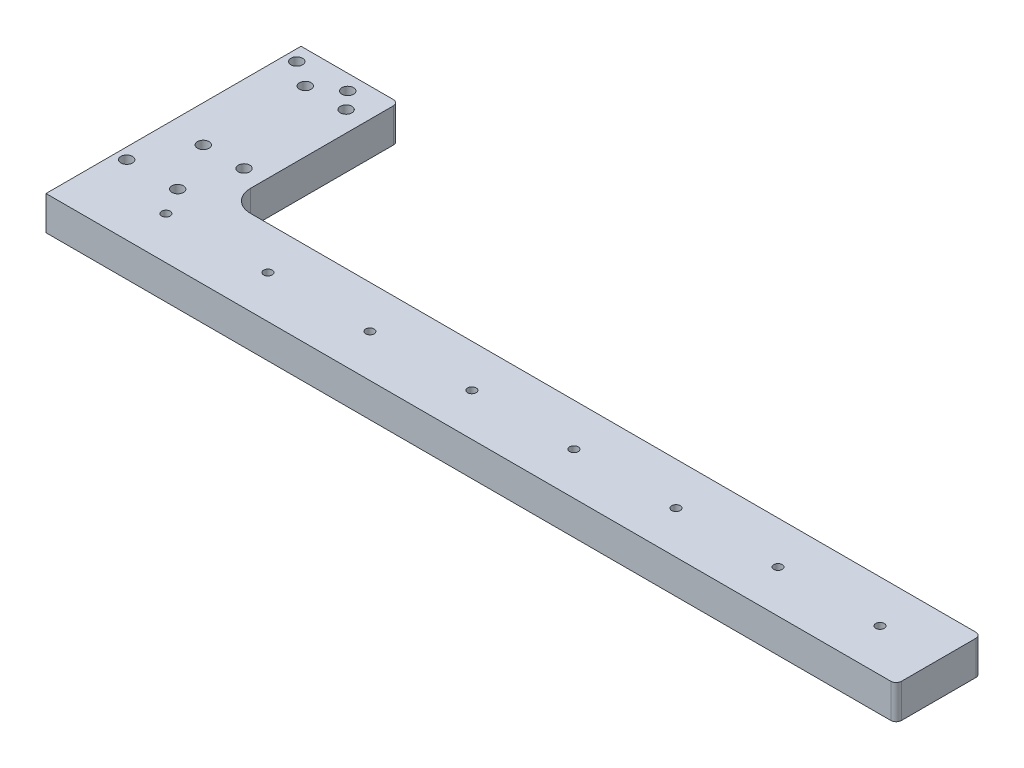
ISO-10303-21;
HEADER;
FILE_DESCRIPTION(('STEP AP214'),'2;1');
FILE_NAME('part.step','',(''),(''),'','','');
FILE_SCHEMA(('AUTOMOTIVE_DESIGN { 1 0 10303 214 1 1 1 1 }'));
ENDSEC;
DATA;
#1=APPLICATION_CONTEXT('core data for automotive mechanical design processes');
#2=APPLICATION_PROTOCOL_DEFINITION('international standard','automotive_design',2000,#1);
#3=PRODUCT_CONTEXT('',#1,'mechanical');
#4=PRODUCT('Part','Part','',(#3));
#5=PRODUCT_RELATED_PRODUCT_CATEGORY('part','',(#4));
#6=PRODUCT_DEFINITION_FORMATION('','',#4);
#7=PRODUCT_DEFINITION_CONTEXT('part definition',#1,'design');
#8=PRODUCT_DEFINITION('design','',#6,#7);
#9=PRODUCT_DEFINITION_SHAPE('','',#8);
#10=(LENGTH_UNIT() NAMED_UNIT(*) SI_UNIT(.MILLI.,.METRE.));
#11=(NAMED_UNIT(*) PLANE_ANGLE_UNIT() SI_UNIT($,.RADIAN.));
#12=(NAMED_UNIT(*) SI_UNIT($,.STERADIAN.) SOLID_ANGLE_UNIT());
#13=UNCERTAINTY_MEASURE_WITH_UNIT(LENGTH_MEASURE(1.E-05),#10,'distance_accuracy_value','');
#14=(GEOMETRIC_REPRESENTATION_CONTEXT(3) GLOBAL_UNCERTAINTY_ASSIGNED_CONTEXT((#13)) GLOBAL_UNIT_ASSIGNED_CONTEXT((#10,
#11,#12)) REPRESENTATION_CONTEXT('',''));
#15=CARTESIAN_POINT('',(0.,0.,0.));
#16=DIRECTION('',(0.,0.,1.));
#17=DIRECTION('',(1.,0.,0.));
#18=AXIS2_PLACEMENT_3D('',#15,#16,#17);
#19=CARTESIAN_POINT('',(465.5,10.,-25.));
#20=DIRECTION('',(0.,1.,0.));
#21=DIRECTION('',(0.,0.,1.));
#22=AXIS2_PLACEMENT_3D('',#19,#20,#21);
#23=CYLINDRICAL_SURFACE('',#22,2.49999999999999);
#24=CARTESIAN_POINT('',(465.5,10.,-25.));
#25=DIRECTION('',(0.,1.,0.));
#26=DIRECTION('',(0.,0.,1.));
#27=AXIS2_PLACEMENT_3D('',#24,#25,#26);
#28=CIRCLE('',#27,2.49999999999999);
#29=CARTESIAN_POINT('',(465.5,10.,-22.5));
#30=VERTEX_POINT('',#29);
#31=EDGE_CURVE('E48',#30,#30,#28,.T.);
#32=ORIENTED_EDGE('',*,*,#31,.T.);
#33=EDGE_LOOP('',(#32));
#34=FACE_BOUND('',#33,.T.);
#35=CARTESIAN_POINT('',(465.5,-10.,-25.));
#36=DIRECTION('',(0.,1.,0.));
#37=DIRECTION('',(0.,0.,1.));
#38=AXIS2_PLACEMENT_3D('',#35,#36,#37);
#39=CIRCLE('',#38,2.49999999999999);
#40=CARTESIAN_POINT('',(465.5,-10.,-22.5));
#41=VERTEX_POINT('',#40);
#42=EDGE_CURVE('E11',#41,#41,#39,.T.);
#43=ORIENTED_EDGE('',*,*,#42,.F.);
#44=EDGE_LOOP('',(#43));
#45=FACE_BOUND('',#44,.T.);
#46=ADVANCED_FACE('F40',(#34,#45),#23,.F.);
#47=CARTESIAN_POINT('',(405.5,10.,-25.));
#48=DIRECTION('',(0.,1.,0.));
#49=DIRECTION('',(0.,0.,1.));
#50=AXIS2_PLACEMENT_3D('',#47,#48,#49);
#51=CYLINDRICAL_SURFACE('',#50,2.49999999999999);
#52=CARTESIAN_POINT('',(405.5,10.,-25.));
#53=DIRECTION('',(0.,1.,0.));
#54=DIRECTION('',(0.,0.,1.));
#55=AXIS2_PLACEMENT_3D('',#52,#53,#54);
#56=CIRCLE('',#55,2.49999999999999);
#57=CARTESIAN_POINT('',(405.5,10.,-22.5));
#58=VERTEX_POINT('',#57);
#59=EDGE_CURVE('E214',#58,#58,#56,.T.);
#60=ORIENTED_EDGE('',*,*,#59,.T.);
#61=EDGE_LOOP('',(#60));
#62=FACE_BOUND('',#61,.T.);
#63=CARTESIAN_POINT('',(405.5,-10.,-25.));
#64=DIRECTION('',(0.,1.,0.));
#65=DIRECTION('',(0.,0.,1.));
#66=AXIS2_PLACEMENT_3D('',#63,#64,#65);
#67=CIRCLE('',#66,2.49999999999999);
#68=CARTESIAN_POINT('',(405.5,-10.,-22.5));
#69=VERTEX_POINT('',#68);
#70=EDGE_CURVE('E217',#69,#69,#67,.T.);
#71=ORIENTED_EDGE('',*,*,#70,.F.);
#72=EDGE_LOOP('',(#71));
#73=FACE_BOUND('',#72,.T.);
#74=ADVANCED_FACE('F241',(#62,#73),#51,.F.);
#75=CARTESIAN_POINT('',(345.5,10.,-25.));
#76=DIRECTION('',(0.,1.,0.));
#77=DIRECTION('',(0.,0.,1.));
#78=AXIS2_PLACEMENT_3D('',#75,#76,#77);
#79=CYLINDRICAL_SURFACE('',#78,2.49999999999999);
#80=CARTESIAN_POINT('',(345.5,10.,-25.));
#81=DIRECTION('',(0.,1.,0.));
#82=DIRECTION('',(0.,0.,1.));
#83=AXIS2_PLACEMENT_3D('',#80,#81,#82);
#84=CIRCLE('',#83,2.49999999999999);
#85=CARTESIAN_POINT('',(345.5,10.,-22.5));
#86=VERTEX_POINT('',#85);
#87=EDGE_CURVE('E208',#86,#86,#84,.T.);
#88=ORIENTED_EDGE('',*,*,#87,.T.);
#89=EDGE_LOOP('',(#88));
#90=FACE_BOUND('',#89,.T.);
#91=CARTESIAN_POINT('',(345.5,-10.,-25.));
#92=DIRECTION('',(0.,1.,0.));
#93=DIRECTION('',(0.,0.,1.));
#94=AXIS2_PLACEMENT_3D('',#91,#92,#93);
#95=CIRCLE('',#94,2.49999999999999);
#96=CARTESIAN_POINT('',(345.5,-10.,-22.5));
#97=VERTEX_POINT('',#96);
#98=EDGE_CURVE('E211',#97,#97,#95,.T.);
#99=ORIENTED_EDGE('',*,*,#98,.F.);
#100=EDGE_LOOP('',(#99));
#101=FACE_BOUND('',#100,.T.);
#102=ADVANCED_FACE('F245',(#90,#101),#79,.F.);
#103=CARTESIAN_POINT('',(285.5,10.,-25.));
#104=DIRECTION('',(0.,1.,0.));
#105=DIRECTION('',(0.,0.,1.));
#106=AXIS2_PLACEMENT_3D('',#103,#104,#105);
#107=CYLINDRICAL_SURFACE('',#106,2.49999999999999);
#108=CARTESIAN_POINT('',(285.5,10.,-25.));
#109=DIRECTION('',(0.,1.,0.));
#110=DIRECTION('',(0.,0.,1.));
#111=AXIS2_PLACEMENT_3D('',#108,#109,#110);
#112=CIRCLE('',#111,2.49999999999999);
#113=CARTESIAN_POINT('',(285.5,10.,-22.5));
#114=VERTEX_POINT('',#113);
#115=EDGE_CURVE('E202',#114,#114,#112,.T.);
#116=ORIENTED_EDGE('',*,*,#115,.T.);
#117=EDGE_LOOP('',(#116));
#118=FACE_BOUND('',#117,.T.);
#119=CARTESIAN_POINT('',(285.5,-10.,-25.));
#120=DIRECTION('',(0.,1.,0.));
#121=DIRECTION('',(0.,0.,1.));
#122=AXIS2_PLACEMENT_3D('',#119,#120,#121);
#123=CIRCLE('',#122,2.49999999999999);
#124=CARTESIAN_POINT('',(285.5,-10.,-22.5));
#125=VERTEX_POINT('',#124);
#126=EDGE_CURVE('E205',#125,#125,#123,.T.);
#127=ORIENTED_EDGE('',*,*,#126,.F.);
#128=EDGE_LOOP('',(#127));
#129=FACE_BOUND('',#128,.T.);
#130=ADVANCED_FACE('F250',(#118,#129),#107,.F.);
#131=CARTESIAN_POINT('',(225.5,10.,-25.));
#132=DIRECTION('',(0.,1.,0.));
#133=DIRECTION('',(0.,0.,1.));
#134=AXIS2_PLACEMENT_3D('',#131,#132,#133);
#135=CYLINDRICAL_SURFACE('',#134,2.49999999999999);
#136=CARTESIAN_POINT('',(225.5,10.,-25.));
#137=DIRECTION('',(0.,1.,0.));
#138=DIRECTION('',(0.,0.,1.));
#139=AXIS2_PLACEMENT_3D('',#136,#137,#138);
#140=CIRCLE('',#139,2.49999999999999);
#141=CARTESIAN_POINT('',(225.5,10.,-22.5));
#142=VERTEX_POINT('',#141);
#143=EDGE_CURVE('E196',#142,#142,#140,.T.);
#144=ORIENTED_EDGE('',*,*,#143,.T.);
#145=EDGE_LOOP('',(#144));
#146=FACE_BOUND('',#145,.T.);
#147=CARTESIAN_POINT('',(225.5,-10.,-25.));
#148=DIRECTION('',(0.,1.,0.));
#149=DIRECTION('',(0.,0.,1.));
#150=AXIS2_PLACEMENT_3D('',#147,#148,#149);
#151=CIRCLE('',#150,2.49999999999999);
#152=CARTESIAN_POINT('',(225.5,-10.,-22.5));
#153=VERTEX_POINT('',#152);
#154=EDGE_CURVE('E199',#153,#153,#151,.T.);
#155=ORIENTED_EDGE('',*,*,#154,.F.);
#156=EDGE_LOOP('',(#155));
#157=FACE_BOUND('',#156,.T.);
#158=ADVANCED_FACE('F257',(#146,#157),#135,.F.);
#159=CARTESIAN_POINT('',(165.5,10.,-25.));
#160=DIRECTION('',(0.,1.,0.));
#161=DIRECTION('',(0.,0.,1.));
#162=AXIS2_PLACEMENT_3D('',#159,#160,#161);
#163=CYLINDRICAL_SURFACE('',#162,2.49999999999999);
#164=CARTESIAN_POINT('',(165.5,10.,-25.));
#165=DIRECTION('',(0.,1.,0.));
#166=DIRECTION('',(0.,0.,1.));
#167=AXIS2_PLACEMENT_3D('',#164,#165,#166);
#168=CIRCLE('',#167,2.49999999999999);
#169=CARTESIAN_POINT('',(165.5,10.,-22.5));
#170=VERTEX_POINT('',#169);
#171=EDGE_CURVE('E190',#170,#170,#168,.T.);
#172=ORIENTED_EDGE('',*,*,#171,.T.);
#173=EDGE_LOOP('',(#172));
#174=FACE_BOUND('',#173,.T.);
#175=CARTESIAN_POINT('',(165.5,-10.,-25.));
#176=DIRECTION('',(0.,1.,0.));
#177=DIRECTION('',(0.,0.,1.));
#178=AXIS2_PLACEMENT_3D('',#175,#176,#177);
#179=CIRCLE('',#178,2.49999999999999);
#180=CARTESIAN_POINT('',(165.5,-10.,-22.5));
#181=VERTEX_POINT('',#180);
#182=EDGE_CURVE('E193',#181,#181,#179,.T.);
#183=ORIENTED_EDGE('',*,*,#182,.F.);
#184=EDGE_LOOP('',(#183));
#185=FACE_BOUND('',#184,.T.);
#186=ADVANCED_FACE('F261',(#174,#185),#163,.F.);
#187=CARTESIAN_POINT('',(0.,10.,0.));
#188=DIRECTION('',(1.,0.,0.));
#189=DIRECTION('',(0.,0.,-1.));
#190=AXIS2_PLACEMENT_3D('',#187,#188,#189);
#191=PLANE('',#190);
#192=DIRECTION('',(0.,0.,1.));
#193=VECTOR('',#192,1.);
#194=CARTESIAN_POINT('',(0.,-10.,0.));
#195=LINE('',#194,#193);
#196=CARTESIAN_POINT('',(0.,-10.,-150.));
#197=VERTEX_POINT('',#196);
#198=CARTESIAN_POINT('',(0.,-10.,0.));
#199=VERTEX_POINT('',#198);
#200=EDGE_CURVE('E150',#197,#199,#195,.T.);
#201=ORIENTED_EDGE('',*,*,#200,.T.);
#202=DIRECTION('',(0.,-1.,0.));
#203=VECTOR('',#202,1.);
#204=CARTESIAN_POINT('',(0.,10.,0.));
#205=LINE('',#204,#203);
#206=CARTESIAN_POINT('',(0.,10.,0.));
#207=VERTEX_POINT('',#206);
#208=EDGE_CURVE('E188',#207,#199,#205,.T.);
#209=ORIENTED_EDGE('',*,*,#208,.F.);
#210=DIRECTION('',(0.,0.,1.));
#211=VECTOR('',#210,1.);
#212=CARTESIAN_POINT('',(0.,10.,0.));
#213=LINE('',#212,#211);
#214=CARTESIAN_POINT('',(0.,10.,-150.));
#215=VERTEX_POINT('',#214);
#216=EDGE_CURVE('E169',#215,#207,#213,.T.);
#217=ORIENTED_EDGE('',*,*,#216,.F.);
#218=DIRECTION('',(0.,-1.,0.));
#219=VECTOR('',#218,1.);
#220=CARTESIAN_POINT('',(0.,10.,-150.));
#221=LINE('',#220,#219);
#222=EDGE_CURVE('E146',#215,#197,#221,.T.);
#223=ORIENTED_EDGE('',*,*,#222,.T.);
#224=EDGE_LOOP('',(#201,#209,#217,#223));
#225=FACE_BOUND('',#224,.T.);
#226=ADVANCED_FACE('F265',(#225),#191,.F.);
#227=CARTESIAN_POINT('',(0.,10.,0.));
#228=DIRECTION('',(0.,0.,-1.));
#229=DIRECTION('',(-1.,0.,0.));
#230=AXIS2_PLACEMENT_3D('',#227,#228,#229);
#231=PLANE('',#230);
#232=DIRECTION('',(1.,0.,0.));
#233=VECTOR('',#232,1.);
#234=CARTESIAN_POINT('',(0.,-10.,0.));
#235=LINE('',#234,#233);
#236=CARTESIAN_POINT('',(496.825,-10.,0.));
#237=VERTEX_POINT('',#236);
#238=EDGE_CURVE('E153',#199,#237,#235,.T.);
#239=ORIENTED_EDGE('',*,*,#238,.T.);
#240=DIRECTION('',(0.,-1.,0.));
#241=VECTOR('',#240,1.);
#242=CARTESIAN_POINT('',(496.825,10.,0.));
#243=LINE('',#242,#241);
#244=CARTESIAN_POINT('',(496.825,10.,0.));
#245=VERTEX_POINT('',#244);
#246=EDGE_CURVE('E185',#245,#237,#243,.T.);
#247=ORIENTED_EDGE('',*,*,#246,.F.);
#248=DIRECTION('',(1.,0.,0.));
#249=VECTOR('',#248,1.);
#250=CARTESIAN_POINT('',(0.,10.,0.));
#251=LINE('',#250,#249);
#252=EDGE_CURVE('E106',#207,#245,#251,.T.);
#253=ORIENTED_EDGE('',*,*,#252,.F.);
#254=ORIENTED_EDGE('',*,*,#208,.T.);
#255=EDGE_LOOP('',(#239,#247,#253,#254));
#256=FACE_BOUND('',#255,.T.);
#257=ADVANCED_FACE('F269',(#256),#231,.F.);
#258=CARTESIAN_POINT('',(496.825,10.,-3.175));
#259=DIRECTION('',(0.,-1.,0.));
#260=DIRECTION('',(0.,0.,-1.));
#261=AXIS2_PLACEMENT_3D('',#258,#259,#260);
#262=CYLINDRICAL_SURFACE('',#261,3.17499999999999);
#263=CARTESIAN_POINT('',(496.825,-10.,-3.175));
#264=DIRECTION('',(0.,1.,0.));
#265=DIRECTION('',(0.,0.,1.));
#266=AXIS2_PLACEMENT_3D('',#263,#264,#265);
#267=CIRCLE('',#266,3.17499999999999);
#268=CARTESIAN_POINT('',(500.,-10.,-3.17500000000002));
#269=VERTEX_POINT('',#268);
#270=EDGE_CURVE('E156',#237,#269,#267,.T.);
#271=ORIENTED_EDGE('',*,*,#270,.T.);
#272=DIRECTION('',(0.,-1.,0.));
#273=VECTOR('',#272,1.);
#274=CARTESIAN_POINT('',(500.,10.,-3.17500000000002));
#275=LINE('',#274,#273);
#276=CARTESIAN_POINT('',(500.,10.,-3.17500000000002));
#277=VERTEX_POINT('',#276);
#278=EDGE_CURVE('E182',#277,#269,#275,.T.);
#279=ORIENTED_EDGE('',*,*,#278,.F.);
#280=CARTESIAN_POINT('',(496.825,10.,-3.175));
#281=DIRECTION('',(0.,1.,0.));
#282=DIRECTION('',(0.,0.,1.));
#283=AXIS2_PLACEMENT_3D('',#280,#281,#282);
#284=CIRCLE('',#283,3.17499999999999);
#285=EDGE_CURVE('E814',#245,#277,#284,.T.);
#286=ORIENTED_EDGE('',*,*,#285,.F.);
#287=ORIENTED_EDGE('',*,*,#246,.T.);
#288=EDGE_LOOP('',(#271,#279,#286,#287));
#289=FACE_BOUND('',#288,.T.);
#290=ADVANCED_FACE('F273',(#289),#262,.T.);
#291=CARTESIAN_POINT('',(500.,10.,-3.17500000000002));
#292=DIRECTION('',(-1.,0.,0.));
#293=DIRECTION('',(0.,0.,1.));
#294=AXIS2_PLACEMENT_3D('',#291,#292,#293);
#295=PLANE('',#294);
#296=DIRECTION('',(0.,0.,-1.));
#297=VECTOR('',#296,1.);
#298=CARTESIAN_POINT('',(500.,-10.,-3.17500000000002));
#299=LINE('',#298,#297);
#300=CARTESIAN_POINT('',(500.,-10.,-46.825));
#301=VERTEX_POINT('',#300);
#302=EDGE_CURVE('E158',#269,#301,#299,.T.);
#303=ORIENTED_EDGE('',*,*,#302,.T.);
#304=DIRECTION('',(0.,-1.,0.));
#305=VECTOR('',#304,1.);
#306=CARTESIAN_POINT('',(500.,10.,-46.825));
#307=LINE('',#306,#305);
#308=CARTESIAN_POINT('',(500.,10.,-46.825));
#309=VERTEX_POINT('',#308);
#310=EDGE_CURVE('E179',#309,#301,#307,.T.);
#311=ORIENTED_EDGE('',*,*,#310,.F.);
#312=DIRECTION('',(0.,0.,-1.));
#313=VECTOR('',#312,1.);
#314=CARTESIAN_POINT('',(500.,10.,-3.17500000000002));
#315=LINE('',#314,#313);
#316=EDGE_CURVE('E816',#277,#309,#315,.T.);
#317=ORIENTED_EDGE('',*,*,#316,.F.);
#318=ORIENTED_EDGE('',*,*,#278,.T.);
#319=EDGE_LOOP('',(#303,#311,#317,#318));
#320=FACE_BOUND('',#319,.T.);
#321=ADVANCED_FACE('F276',(#320),#295,.F.);
#322=CARTESIAN_POINT('',(496.825,10.,-46.825));
#323=DIRECTION('',(0.,-1.,0.));
#324=DIRECTION('',(0.,0.,-1.));
#325=AXIS2_PLACEMENT_3D('',#322,#323,#324);
#326=CYLINDRICAL_SURFACE('',#325,3.17499999999999);
#327=CARTESIAN_POINT('',(496.825,-10.,-46.825));
#328=DIRECTION('',(0.,1.,0.));
#329=DIRECTION('',(0.,0.,1.));
#330=AXIS2_PLACEMENT_3D('',#327,#328,#329);
#331=CIRCLE('',#330,3.17499999999999);
#332=CARTESIAN_POINT('',(496.825,-10.,-50.));
#333=VERTEX_POINT('',#332);
#334=EDGE_CURVE('E160',#301,#333,#331,.T.);
#335=ORIENTED_EDGE('',*,*,#334,.T.);
#336=DIRECTION('',(0.,-1.,0.));
#337=VECTOR('',#336,1.);
#338=CARTESIAN_POINT('',(496.825,10.,-50.));
#339=LINE('',#338,#337);
#340=CARTESIAN_POINT('',(496.825,10.,-50.));
#341=VERTEX_POINT('',#340);
#342=EDGE_CURVE('E176',#341,#333,#339,.T.);
#343=ORIENTED_EDGE('',*,*,#342,.F.);
#344=CARTESIAN_POINT('',(496.825,10.,-46.825));
#345=DIRECTION('',(0.,1.,0.));
#346=DIRECTION('',(0.,0.,1.));
#347=AXIS2_PLACEMENT_3D('',#344,#345,#346);
#348=CIRCLE('',#347,3.17499999999999);
#349=EDGE_CURVE('E818',#309,#341,#348,.T.);
#350=ORIENTED_EDGE('',*,*,#349,.F.);
#351=ORIENTED_EDGE('',*,*,#310,.T.);
#352=EDGE_LOOP('',(#335,#343,#350,#351));
#353=FACE_BOUND('',#352,.T.);
#354=ADVANCED_FACE('F280',(#353),#326,.T.);
#355=CARTESIAN_POINT('',(496.825,10.,-50.));
#356=DIRECTION('',(0.,0.,1.));
#357=DIRECTION('',(1.,0.,0.));
#358=AXIS2_PLACEMENT_3D('',#355,#356,#357);
#359=PLANE('',#358);
#360=DIRECTION('',(-1.,0.,0.));
#361=VECTOR('',#360,1.);
#362=CARTESIAN_POINT('',(496.825,-10.,-50.));
#363=LINE('',#362,#361);
#364=CARTESIAN_POINT('',(70.2000000000001,-10.,-50.));
#365=VERTEX_POINT('',#364);
#366=EDGE_CURVE('E162',#333,#365,#363,.T.);
#367=ORIENTED_EDGE('',*,*,#366,.T.);
#368=DIRECTION('',(0.,-1.,0.));
#369=VECTOR('',#368,1.);
#370=CARTESIAN_POINT('',(70.2000000000001,10.,-50.));
#371=LINE('',#370,#369);
#372=CARTESIAN_POINT('',(70.2000000000001,10.,-50.));
#373=VERTEX_POINT('',#372);
#374=EDGE_CURVE('E173',#373,#365,#371,.T.);
#375=ORIENTED_EDGE('',*,*,#374,.F.);
#376=DIRECTION('',(-1.,0.,0.));
#377=VECTOR('',#376,1.);
#378=CARTESIAN_POINT('',(496.825,10.,-50.));
#379=LINE('',#378,#377);
#380=EDGE_CURVE('E820',#341,#373,#379,.T.);
#381=ORIENTED_EDGE('',*,*,#380,.F.);
#382=ORIENTED_EDGE('',*,*,#342,.T.);
#383=EDGE_LOOP('',(#367,#375,#381,#382));
#384=FACE_BOUND('',#383,.T.);
#385=ADVANCED_FACE('F284',(#384),#359,.F.);
#386=CARTESIAN_POINT('',(70.2,10.,-62.7));
#387=DIRECTION('',(0.,-1.,0.));
#388=DIRECTION('',(0.,0.,-1.));
#389=AXIS2_PLACEMENT_3D('',#386,#387,#388);
#390=CYLINDRICAL_SURFACE('',#389,12.7);
#391=CARTESIAN_POINT('',(70.2,-10.,-62.7));
#392=DIRECTION('',(0.,-1.,0.));
#393=DIRECTION('',(0.,0.,-1.));
#394=AXIS2_PLACEMENT_3D('',#391,#392,#393);
#395=CIRCLE('',#394,12.7);
#396=CARTESIAN_POINT('',(57.5,-10.,-62.7));
#397=VERTEX_POINT('',#396);
#398=EDGE_CURVE('E164',#365,#397,#395,.T.);
#399=ORIENTED_EDGE('',*,*,#398,.T.);
#400=DIRECTION('',(0.,-1.,0.));
#401=VECTOR('',#400,1.);
#402=CARTESIAN_POINT('',(57.5,10.,-62.7));
#403=LINE('',#402,#401);
#404=CARTESIAN_POINT('',(57.5,10.,-62.7));
#405=VERTEX_POINT('',#404);
#406=EDGE_CURVE('E141',#405,#397,#403,.T.);
#407=ORIENTED_EDGE('',*,*,#406,.F.);
#408=CARTESIAN_POINT('',(70.2,10.,-62.7));
#409=DIRECTION('',(0.,-1.,0.));
#410=DIRECTION('',(0.,0.,-1.));
#411=AXIS2_PLACEMENT_3D('',#408,#409,#410);
#412=CIRCLE('',#411,12.7);
#413=EDGE_CURVE('E132',#373,#405,#412,.T.);
#414=ORIENTED_EDGE('',*,*,#413,.F.);
#415=ORIENTED_EDGE('',*,*,#374,.T.);
#416=EDGE_LOOP('',(#399,#407,#414,#415));
#417=FACE_BOUND('',#416,.T.);
#418=ADVANCED_FACE('F288',(#417),#390,.F.);
#419=CARTESIAN_POINT('',(57.5,10.,-146.825));
#420=DIRECTION('',(-1.,0.,0.));
#421=DIRECTION('',(0.,0.,1.));
#422=AXIS2_PLACEMENT_3D('',#419,#420,#421);
#423=PLANE('',#422);
#424=DIRECTION('',(0.,0.,-1.));
#425=VECTOR('',#424,1.);
#426=CARTESIAN_POINT('',(57.5,-10.,-146.825));
#427=LINE('',#426,#425);
#428=CARTESIAN_POINT('',(57.5,-10.,-146.825));
#429=VERTEX_POINT('',#428);
#430=EDGE_CURVE('E140',#397,#429,#427,.T.);
#431=ORIENTED_EDGE('',*,*,#430,.T.);
#432=DIRECTION('',(0.,-1.,0.));
#433=VECTOR('',#432,1.);
#434=CARTESIAN_POINT('',(57.5,10.,-146.825));
#435=LINE('',#434,#433);
#436=CARTESIAN_POINT('',(57.5,10.,-146.825));
#437=VERTEX_POINT('',#436);
#438=EDGE_CURVE('E137',#437,#429,#435,.T.);
#439=ORIENTED_EDGE('',*,*,#438,.F.);
#440=DIRECTION('',(0.,0.,-1.));
#441=VECTOR('',#440,1.);
#442=CARTESIAN_POINT('',(57.5,10.,-146.825));
#443=LINE('',#442,#441);
#444=EDGE_CURVE('E125',#405,#437,#443,.T.);
#445=ORIENTED_EDGE('',*,*,#444,.F.);
#446=ORIENTED_EDGE('',*,*,#406,.T.);
#447=EDGE_LOOP('',(#431,#439,#445,#446));
#448=FACE_BOUND('',#447,.T.);
#449=ADVANCED_FACE('F138',(#448),#423,.F.);
#450=CARTESIAN_POINT('',(54.325,10.,-146.825));
#451=DIRECTION('',(0.,-1.,0.));
#452=DIRECTION('',(0.,0.,-1.));
#453=AXIS2_PLACEMENT_3D('',#450,#451,#452);
#454=CYLINDRICAL_SURFACE('',#453,3.175);
#455=CARTESIAN_POINT('',(54.325,-10.,-146.825));
#456=DIRECTION('',(0.,1.,0.));
#457=DIRECTION('',(0.,0.,1.));
#458=AXIS2_PLACEMENT_3D('',#455,#456,#457);
#459=CIRCLE('',#458,3.175);
#460=CARTESIAN_POINT('',(54.325,-10.,-150.));
#461=VERTEX_POINT('',#460);
#462=EDGE_CURVE('E91',#429,#461,#459,.T.);
#463=ORIENTED_EDGE('',*,*,#462,.T.);
#464=DIRECTION('',(0.,-1.,0.));
#465=VECTOR('',#464,1.);
#466=CARTESIAN_POINT('',(54.325,10.,-150.));
#467=LINE('',#466,#465);
#468=CARTESIAN_POINT('',(54.325,10.,-150.));
#469=VERTEX_POINT('',#468);
#470=EDGE_CURVE('E142',#469,#461,#467,.T.);
#471=ORIENTED_EDGE('',*,*,#470,.F.);
#472=CARTESIAN_POINT('',(54.325,10.,-146.825));
#473=DIRECTION('',(0.,1.,0.));
#474=DIRECTION('',(0.,0.,1.));
#475=AXIS2_PLACEMENT_3D('',#472,#473,#474);
#476=CIRCLE('',#475,3.175);
#477=EDGE_CURVE('E130',#437,#469,#476,.T.);
#478=ORIENTED_EDGE('',*,*,#477,.F.);
#479=ORIENTED_EDGE('',*,*,#438,.T.);
#480=EDGE_LOOP('',(#463,#471,#478,#479));
#481=FACE_BOUND('',#480,.T.);
#482=ADVANCED_FACE('F144',(#481),#454,.T.);
#483=CARTESIAN_POINT('',(0.,10.,-150.));
#484=DIRECTION('',(0.,0.,1.));
#485=DIRECTION('',(1.,0.,0.));
#486=AXIS2_PLACEMENT_3D('',#483,#484,#485);
#487=PLANE('',#486);
#488=DIRECTION('',(-1.,0.,0.));
#489=VECTOR('',#488,1.);
#490=CARTESIAN_POINT('',(0.,-10.,-150.));
#491=LINE('',#490,#489);
#492=EDGE_CURVE('E97',#461,#197,#491,.T.);
#493=ORIENTED_EDGE('',*,*,#492,.T.);
#494=ORIENTED_EDGE('',*,*,#222,.F.);
#495=DIRECTION('',(-1.,0.,0.));
#496=VECTOR('',#495,1.);
#497=CARTESIAN_POINT('',(0.,10.,-150.));
#498=LINE('',#497,#496);
#499=EDGE_CURVE('E56',#469,#215,#498,.T.);
#500=ORIENTED_EDGE('',*,*,#499,.F.);
#501=ORIENTED_EDGE('',*,*,#470,.T.);
#502=EDGE_LOOP('',(#493,#494,#500,#501));
#503=FACE_BOUND('',#502,.T.);
#504=ADVANCED_FACE('F226',(#503),#487,.F.);
#505=CARTESIAN_POINT('',(54.325,10.,-146.825));
#506=DIRECTION('',(0.,1.,0.));
#507=DIRECTION('',(0.,0.,1.));
#508=AXIS2_PLACEMENT_3D('',#505,#506,#507);
#509=PLANE('',#508);
#510=CARTESIAN_POINT('',(36.5,10.,-140.950000036));
#511=DIRECTION('',(0.,1.,0.));
#512=DIRECTION('',(0.,0.,1.));
#513=AXIS2_PLACEMENT_3D('',#510,#511,#512);
#514=CIRCLE('',#513,3.4);
#515=CARTESIAN_POINT('',(36.5,10.,-137.550000036));
#516=VERTEX_POINT('',#515);
#517=EDGE_CURVE('E753',#516,#516,#514,.T.);
#518=ORIENTED_EDGE('',*,*,#517,.F.);
#519=EDGE_LOOP('',(#518));
#520=FACE_BOUND('',#519,.T.);
#521=CARTESIAN_POINT('',(6.5,10.,-140.950000036));
#522=DIRECTION('',(0.,1.,0.));
#523=DIRECTION('',(0.,0.,1.));
#524=AXIS2_PLACEMENT_3D('',#521,#522,#523);
#525=CIRCLE('',#524,3.4);
#526=CARTESIAN_POINT('',(6.5,10.,-137.550000036));
#527=VERTEX_POINT('',#526);
#528=EDGE_CURVE('E759',#527,#527,#525,.T.);
#529=ORIENTED_EDGE('',*,*,#528,.F.);
#530=EDGE_LOOP('',(#529));
#531=FACE_BOUND('',#530,.T.);
#532=CARTESIAN_POINT('',(6.5,10.,-40.950000036));
#533=DIRECTION('',(0.,1.,0.));
#534=DIRECTION('',(0.,0.,1.));
#535=AXIS2_PLACEMENT_3D('',#532,#533,#534);
#536=CIRCLE('',#535,3.4);
#537=CARTESIAN_POINT('',(6.5,10.,-37.550000036));
#538=VERTEX_POINT('',#537);
#539=EDGE_CURVE('E765',#538,#538,#536,.T.);
#540=ORIENTED_EDGE('',*,*,#539,.F.);
#541=EDGE_LOOP('',(#540));
#542=FACE_BOUND('',#541,.T.);
#543=CARTESIAN_POINT('',(36.5,10.,-40.950000036));
#544=DIRECTION('',(0.,1.,0.));
#545=DIRECTION('',(0.,0.,1.));
#546=AXIS2_PLACEMENT_3D('',#543,#544,#545);
#547=CIRCLE('',#546,3.4);
#548=CARTESIAN_POINT('',(36.5,10.,-37.550000036));
#549=VERTEX_POINT('',#548);
#550=EDGE_CURVE('E771',#549,#549,#547,.T.);
#551=ORIENTED_EDGE('',*,*,#550,.F.);
#552=EDGE_LOOP('',(#551));
#553=FACE_BOUND('',#552,.T.);
#554=CARTESIAN_POINT('',(45.5,10.,-131.));
#555=DIRECTION('',(0.,1.,0.));
#556=DIRECTION('',(0.,0.,1.));
#557=AXIS2_PLACEMENT_3D('',#554,#555,#556);
#558=CIRCLE('',#557,3.39999999999999);
#559=CARTESIAN_POINT('',(45.5,10.,-127.6));
#560=VERTEX_POINT('',#559);
#561=EDGE_CURVE('E777',#560,#560,#558,.T.);
#562=ORIENTED_EDGE('',*,*,#561,.F.);
#563=EDGE_LOOP('',(#562));
#564=FACE_BOUND('',#563,.T.);
#565=CARTESIAN_POINT('',(21.5,10.,-131.));
#566=DIRECTION('',(0.,1.,0.));
#567=DIRECTION('',(0.,0.,1.));
#568=AXIS2_PLACEMENT_3D('',#565,#566,#567);
#569=CIRCLE('',#568,3.39999999999999);
#570=CARTESIAN_POINT('',(21.5,10.,-127.6));
#571=VERTEX_POINT('',#570);
#572=EDGE_CURVE('E783',#571,#571,#569,.T.);
#573=ORIENTED_EDGE('',*,*,#572,.F.);
#574=EDGE_LOOP('',(#573));
#575=FACE_BOUND('',#574,.T.);
#576=CARTESIAN_POINT('',(45.5,10.,-71.));
#577=DIRECTION('',(0.,1.,0.));
#578=DIRECTION('',(0.,0.,1.));
#579=AXIS2_PLACEMENT_3D('',#576,#577,#578);
#580=CIRCLE('',#579,3.39999999999999);
#581=CARTESIAN_POINT('',(45.5,10.,-67.6));
#582=VERTEX_POINT('',#581);
#583=EDGE_CURVE('E789',#582,#582,#580,.T.);
#584=ORIENTED_EDGE('',*,*,#583,.F.);
#585=EDGE_LOOP('',(#584));
#586=FACE_BOUND('',#585,.T.);
#587=CARTESIAN_POINT('',(21.5,10.,-71.));
#588=DIRECTION('',(0.,1.,0.));
#589=DIRECTION('',(0.,0.,1.));
#590=AXIS2_PLACEMENT_3D('',#587,#588,#589);
#591=CIRCLE('',#590,3.39999999999999);
#592=CARTESIAN_POINT('',(21.5,10.,-67.6));
#593=VERTEX_POINT('',#592);
#594=EDGE_CURVE('E795',#593,#593,#591,.T.);
#595=ORIENTED_EDGE('',*,*,#594,.F.);
#596=EDGE_LOOP('',(#595));
#597=FACE_BOUND('',#596,.T.);
#598=CARTESIAN_POINT('',(105.5,10.,-25.));
#599=DIRECTION('',(0.,1.,0.));
#600=DIRECTION('',(0.,0.,1.));
#601=AXIS2_PLACEMENT_3D('',#598,#599,#600);
#602=CIRCLE('',#601,2.49999999999999);
#603=CARTESIAN_POINT('',(105.5,10.,-22.5));
#604=VERTEX_POINT('',#603);
#605=EDGE_CURVE('E801',#604,#604,#602,.T.);
#606=ORIENTED_EDGE('',*,*,#605,.F.);
#607=EDGE_LOOP('',(#606));
#608=FACE_BOUND('',#607,.T.);
#609=CARTESIAN_POINT('',(45.5,10.,-25.));
#610=DIRECTION('',(0.,1.,0.));
#611=DIRECTION('',(0.,0.,1.));
#612=AXIS2_PLACEMENT_3D('',#609,#610,#611);
#613=CIRCLE('',#612,2.49999999999999);
#614=CARTESIAN_POINT('',(45.5,10.,-22.5));
#615=VERTEX_POINT('',#614);
#616=EDGE_CURVE('E807',#615,#615,#613,.T.);
#617=ORIENTED_EDGE('',*,*,#616,.F.);
#618=EDGE_LOOP('',(#617));
#619=FACE_BOUND('',#618,.T.);
#620=ORIENTED_EDGE('',*,*,#216,.T.);
#621=ORIENTED_EDGE('',*,*,#252,.T.);
#622=ORIENTED_EDGE('',*,*,#285,.T.);
#623=ORIENTED_EDGE('',*,*,#316,.T.);
#624=ORIENTED_EDGE('',*,*,#349,.T.);
#625=ORIENTED_EDGE('',*,*,#380,.T.);
#626=ORIENTED_EDGE('',*,*,#413,.T.);
#627=ORIENTED_EDGE('',*,*,#444,.T.);
#628=ORIENTED_EDGE('',*,*,#477,.T.);
#629=ORIENTED_EDGE('',*,*,#499,.T.);
#630=EDGE_LOOP('',(#620,#621,#622,#623,#624,#625,#626,#627,#628,#629));
#631=FACE_BOUND('',#630,.T.);
#632=ORIENTED_EDGE('',*,*,#171,.F.);
#633=EDGE_LOOP('',(#632));
#634=FACE_BOUND('',#633,.T.);
#635=ORIENTED_EDGE('',*,*,#143,.F.);
#636=EDGE_LOOP('',(#635));
#637=FACE_BOUND('',#636,.T.);
#638=ORIENTED_EDGE('',*,*,#115,.F.);
#639=EDGE_LOOP('',(#638));
#640=FACE_BOUND('',#639,.T.);
#641=ORIENTED_EDGE('',*,*,#87,.F.);
#642=EDGE_LOOP('',(#641));
#643=FACE_BOUND('',#642,.T.);
#644=ORIENTED_EDGE('',*,*,#59,.F.);
#645=EDGE_LOOP('',(#644));
#646=FACE_BOUND('',#645,.T.);
#647=ORIENTED_EDGE('',*,*,#31,.F.);
#648=EDGE_LOOP('',(#647));
#649=FACE_BOUND('',#648,.T.);
#650=ADVANCED_FACE('F127',(#520,#531,#542,#553,#564,#575,#586,#597,#608,#619,#631,#634,#637,
#640,#643,#646,#649),#509,.T.);
#651=CARTESIAN_POINT('',(54.325,-10.,-146.825));
#652=DIRECTION('',(0.,1.,0.));
#653=DIRECTION('',(0.,0.,1.));
#654=AXIS2_PLACEMENT_3D('',#651,#652,#653);
#655=PLANE('',#654);
#656=CARTESIAN_POINT('',(6.5,-10.,-140.950000036));
#657=DIRECTION('',(0.,1.,0.));
#658=DIRECTION('',(0.,0.,1.));
#659=AXIS2_PLACEMENT_3D('',#656,#657,#658);
#660=CIRCLE('',#659,2.49999999999999);
#661=CARTESIAN_POINT('',(6.5,-10.,-138.450000036));
#662=VERTEX_POINT('',#661);
#663=EDGE_CURVE('E728',#662,#662,#660,.T.);
#664=ORIENTED_EDGE('',*,*,#663,.T.);
#665=EDGE_LOOP('',(#664));
#666=FACE_BOUND('',#665,.T.);
#667=CARTESIAN_POINT('',(36.5,-10.,-140.950000036));
#668=DIRECTION('',(0.,1.,0.));
#669=DIRECTION('',(0.,0.,1.));
#670=AXIS2_PLACEMENT_3D('',#667,#668,#669);
#671=CIRCLE('',#670,2.5);
#672=CARTESIAN_POINT('',(36.5,-10.,-138.450000036));
#673=VERTEX_POINT('',#672);
#674=EDGE_CURVE('E732',#673,#673,#671,.T.);
#675=ORIENTED_EDGE('',*,*,#674,.T.);
#676=EDGE_LOOP('',(#675));
#677=FACE_BOUND('',#676,.T.);
#678=CARTESIAN_POINT('',(36.5,-10.,-40.950000036));
#679=DIRECTION('',(0.,1.,0.));
#680=DIRECTION('',(0.,0.,1.));
#681=AXIS2_PLACEMENT_3D('',#678,#679,#680);
#682=CIRCLE('',#681,2.5);
#683=CARTESIAN_POINT('',(36.5,-10.,-38.450000036));
#684=VERTEX_POINT('',#683);
#685=EDGE_CURVE('E741',#684,#684,#682,.T.);
#686=ORIENTED_EDGE('',*,*,#685,.T.);
#687=EDGE_LOOP('',(#686));
#688=FACE_BOUND('',#687,.T.);
#689=CARTESIAN_POINT('',(6.5,-10.,-40.950000036));
#690=DIRECTION('',(0.,1.,0.));
#691=DIRECTION('',(0.,0.,1.));
#692=AXIS2_PLACEMENT_3D('',#689,#690,#691);
#693=CIRCLE('',#692,2.49999999999999);
#694=CARTESIAN_POINT('',(6.5,-10.,-38.450000036));
#695=VERTEX_POINT('',#694);
#696=EDGE_CURVE('E747',#695,#695,#693,.T.);
#697=ORIENTED_EDGE('',*,*,#696,.T.);
#698=EDGE_LOOP('',(#697));
#699=FACE_BOUND('',#698,.T.);
#700=CARTESIAN_POINT('',(45.5,-10.,-131.));
#701=DIRECTION('',(0.,1.,0.));
#702=DIRECTION('',(0.,0.,1.));
#703=AXIS2_PLACEMENT_3D('',#700,#701,#702);
#704=CIRCLE('',#703,3.39999999999999);
#705=CARTESIAN_POINT('',(45.5,-10.,-127.6));
#706=VERTEX_POINT('',#705);
#707=EDGE_CURVE('E780',#706,#706,#704,.T.);
#708=ORIENTED_EDGE('',*,*,#707,.T.);
#709=EDGE_LOOP('',(#708));
#710=FACE_BOUND('',#709,.T.);
#711=CARTESIAN_POINT('',(21.5,-10.,-131.));
#712=DIRECTION('',(0.,1.,0.));
#713=DIRECTION('',(0.,0.,1.));
#714=AXIS2_PLACEMENT_3D('',#711,#712,#713);
#715=CIRCLE('',#714,3.39999999999999);
#716=CARTESIAN_POINT('',(21.5,-10.,-127.6));
#717=VERTEX_POINT('',#716);
#718=EDGE_CURVE('E786',#717,#717,#715,.T.);
#719=ORIENTED_EDGE('',*,*,#718,.T.);
#720=EDGE_LOOP('',(#719));
#721=FACE_BOUND('',#720,.T.);
#722=CARTESIAN_POINT('',(45.5,-10.,-71.));
#723=DIRECTION('',(0.,1.,0.));
#724=DIRECTION('',(0.,0.,1.));
#725=AXIS2_PLACEMENT_3D('',#722,#723,#724);
#726=CIRCLE('',#725,3.39999999999999);
#727=CARTESIAN_POINT('',(45.5,-10.,-67.6));
#728=VERTEX_POINT('',#727);
#729=EDGE_CURVE('E792',#728,#728,#726,.T.);
#730=ORIENTED_EDGE('',*,*,#729,.T.);
#731=EDGE_LOOP('',(#730));
#732=FACE_BOUND('',#731,.T.);
#733=CARTESIAN_POINT('',(21.5,-10.,-71.));
#734=DIRECTION('',(0.,1.,0.));
#735=DIRECTION('',(0.,0.,1.));
#736=AXIS2_PLACEMENT_3D('',#733,#734,#735);
#737=CIRCLE('',#736,3.39999999999999);
#738=CARTESIAN_POINT('',(21.5,-10.,-67.6));
#739=VERTEX_POINT('',#738);
#740=EDGE_CURVE('E798',#739,#739,#737,.T.);
#741=ORIENTED_EDGE('',*,*,#740,.T.);
#742=EDGE_LOOP('',(#741));
#743=FACE_BOUND('',#742,.T.);
#744=CARTESIAN_POINT('',(105.5,-10.,-25.));
#745=DIRECTION('',(0.,1.,0.));
#746=DIRECTION('',(0.,0.,1.));
#747=AXIS2_PLACEMENT_3D('',#744,#745,#746);
#748=CIRCLE('',#747,2.49999999999999);
#749=CARTESIAN_POINT('',(105.5,-10.,-22.5));
#750=VERTEX_POINT('',#749);
#751=EDGE_CURVE('E804',#750,#750,#748,.T.);
#752=ORIENTED_EDGE('',*,*,#751,.T.);
#753=EDGE_LOOP('',(#752));
#754=FACE_BOUND('',#753,.T.);
#755=CARTESIAN_POINT('',(45.5,-10.,-25.));
#756=DIRECTION('',(0.,1.,0.));
#757=DIRECTION('',(0.,0.,1.));
#758=AXIS2_PLACEMENT_3D('',#755,#756,#757);
#759=CIRCLE('',#758,2.49999999999999);
#760=CARTESIAN_POINT('',(45.5,-10.,-22.5));
#761=VERTEX_POINT('',#760);
#762=EDGE_CURVE('E154',#761,#761,#759,.T.);
#763=ORIENTED_EDGE('',*,*,#762,.T.);
#764=EDGE_LOOP('',(#763));
#765=FACE_BOUND('',#764,.T.);
#766=ORIENTED_EDGE('',*,*,#200,.F.);
#767=ORIENTED_EDGE('',*,*,#492,.F.);
#768=ORIENTED_EDGE('',*,*,#462,.F.);
#769=ORIENTED_EDGE('',*,*,#430,.F.);
#770=ORIENTED_EDGE('',*,*,#398,.F.);
#771=ORIENTED_EDGE('',*,*,#366,.F.);
#772=ORIENTED_EDGE('',*,*,#334,.F.);
#773=ORIENTED_EDGE('',*,*,#302,.F.);
#774=ORIENTED_EDGE('',*,*,#270,.F.);
#775=ORIENTED_EDGE('',*,*,#238,.F.);
#776=EDGE_LOOP('',(#766,#767,#768,#769,#770,#771,#772,#773,#774,#775));
#777=FACE_BOUND('',#776,.T.);
#778=ORIENTED_EDGE('',*,*,#182,.T.);
#779=EDGE_LOOP('',(#778));
#780=FACE_BOUND('',#779,.T.);
#781=ORIENTED_EDGE('',*,*,#154,.T.);
#782=EDGE_LOOP('',(#781));
#783=FACE_BOUND('',#782,.T.);
#784=ORIENTED_EDGE('',*,*,#126,.T.);
#785=EDGE_LOOP('',(#784));
#786=FACE_BOUND('',#785,.T.);
#787=ORIENTED_EDGE('',*,*,#98,.T.);
#788=EDGE_LOOP('',(#787));
#789=FACE_BOUND('',#788,.T.);
#790=ORIENTED_EDGE('',*,*,#70,.T.);
#791=EDGE_LOOP('',(#790));
#792=FACE_BOUND('',#791,.T.);
#793=ORIENTED_EDGE('',*,*,#42,.T.);
#794=EDGE_LOOP('',(#793));
#795=FACE_BOUND('',#794,.T.);
#796=ADVANCED_FACE('F225',(#666,#677,#688,#699,#710,#721,#732,#743,#754,#765,#777,#780,#783,
#786,#789,#792,#795),#655,.F.);
#797=CARTESIAN_POINT('',(45.5,10.,-25.));
#798=DIRECTION('',(0.,1.,0.));
#799=DIRECTION('',(0.,0.,1.));
#800=AXIS2_PLACEMENT_3D('',#797,#798,#799);
#801=CYLINDRICAL_SURFACE('',#800,2.49999999999999);
#802=ORIENTED_EDGE('',*,*,#616,.T.);
#803=EDGE_LOOP('',(#802));
#804=FACE_BOUND('',#803,.T.);
#805=ORIENTED_EDGE('',*,*,#762,.F.);
#806=EDGE_LOOP('',(#805));
#807=FACE_BOUND('',#806,.T.);
#808=ADVANCED_FACE('F233',(#804,#807),#801,.F.);
#809=CARTESIAN_POINT('',(105.5,10.,-25.));
#810=DIRECTION('',(0.,1.,0.));
#811=DIRECTION('',(0.,0.,1.));
#812=AXIS2_PLACEMENT_3D('',#809,#810,#811);
#813=CYLINDRICAL_SURFACE('',#812,2.49999999999999);
#814=ORIENTED_EDGE('',*,*,#605,.T.);
#815=EDGE_LOOP('',(#814));
#816=FACE_BOUND('',#815,.T.);
#817=ORIENTED_EDGE('',*,*,#751,.F.);
#818=EDGE_LOOP('',(#817));
#819=FACE_BOUND('',#818,.T.);
#820=ADVANCED_FACE('F315',(#816,#819),#813,.F.);
#821=CARTESIAN_POINT('',(21.5,10.,-71.));
#822=DIRECTION('',(0.,1.,0.));
#823=DIRECTION('',(0.,0.,1.));
#824=AXIS2_PLACEMENT_3D('',#821,#822,#823);
#825=CYLINDRICAL_SURFACE('',#824,3.39999999999999);
#826=ORIENTED_EDGE('',*,*,#740,.F.);
#827=EDGE_LOOP('',(#826));
#828=FACE_BOUND('',#827,.T.);
#829=ORIENTED_EDGE('',*,*,#594,.T.);
#830=EDGE_LOOP('',(#829));
#831=FACE_BOUND('',#830,.T.);
#832=ADVANCED_FACE('F378',(#828,#831),#825,.F.);
#833=CARTESIAN_POINT('',(45.5,10.,-71.));
#834=DIRECTION('',(0.,1.,0.));
#835=DIRECTION('',(0.,0.,1.));
#836=AXIS2_PLACEMENT_3D('',#833,#834,#835);
#837=CYLINDRICAL_SURFACE('',#836,3.39999999999999);
#838=ORIENTED_EDGE('',*,*,#729,.F.);
#839=EDGE_LOOP('',(#838));
#840=FACE_BOUND('',#839,.T.);
#841=ORIENTED_EDGE('',*,*,#583,.T.);
#842=EDGE_LOOP('',(#841));
#843=FACE_BOUND('',#842,.T.);
#844=ADVANCED_FACE('F389',(#840,#843),#837,.F.);
#845=CARTESIAN_POINT('',(21.5,10.,-131.));
#846=DIRECTION('',(0.,1.,0.));
#847=DIRECTION('',(0.,0.,1.));
#848=AXIS2_PLACEMENT_3D('',#845,#846,#847);
#849=CYLINDRICAL_SURFACE('',#848,3.39999999999999);
#850=ORIENTED_EDGE('',*,*,#718,.F.);
#851=EDGE_LOOP('',(#850));
#852=FACE_BOUND('',#851,.T.);
#853=ORIENTED_EDGE('',*,*,#572,.T.);
#854=EDGE_LOOP('',(#853));
#855=FACE_BOUND('',#854,.T.);
#856=ADVANCED_FACE('F401',(#852,#855),#849,.F.);
#857=CARTESIAN_POINT('',(45.5,10.,-131.));
#858=DIRECTION('',(0.,1.,0.));
#859=DIRECTION('',(0.,0.,1.));
#860=AXIS2_PLACEMENT_3D('',#857,#858,#859);
#861=CYLINDRICAL_SURFACE('',#860,3.39999999999999);
#862=ORIENTED_EDGE('',*,*,#707,.F.);
#863=EDGE_LOOP('',(#862));
#864=FACE_BOUND('',#863,.T.);
#865=ORIENTED_EDGE('',*,*,#561,.T.);
#866=EDGE_LOOP('',(#865));
#867=FACE_BOUND('',#866,.T.);
#868=ADVANCED_FACE('F413',(#864,#867),#861,.F.);
#869=CARTESIAN_POINT('',(36.5,1.9999906,-40.950000036));
#870=DIRECTION('',(0.,1.,0.));
#871=DIRECTION('',(0.,0.,1.));
#872=AXIS2_PLACEMENT_3D('',#869,#870,#871);
#873=CONICAL_SURFACE('',#872,3.4,1.02974425867665);
#874=CARTESIAN_POINT('',(36.5,1.45921604287519,-40.950000036));
#875=DIRECTION('',(0.,1.,0.));
#876=DIRECTION('',(0.,0.,1.));
#877=AXIS2_PLACEMENT_3D('',#874,#875,#876);
#878=CIRCLE('',#877,2.49999999999999);
#879=CARTESIAN_POINT('',(36.5,1.45921604287519,-38.450000036));
#880=VERTEX_POINT('',#879);
#881=EDGE_CURVE('E744',#880,#880,#878,.F.);
#882=ORIENTED_EDGE('',*,*,#881,.T.);
#883=EDGE_LOOP('',(#882));
#884=FACE_BOUND('',#883,.T.);
#885=CARTESIAN_POINT('',(36.5,1.9999906,-40.950000036));
#886=DIRECTION('',(0.,1.,0.));
#887=DIRECTION('',(0.,0.,1.));
#888=AXIS2_PLACEMENT_3D('',#885,#886,#887);
#889=CIRCLE('',#888,3.4);
#890=CARTESIAN_POINT('',(36.5,1.9999906,-37.550000036));
#891=VERTEX_POINT('',#890);
#892=EDGE_CURVE('E774',#891,#891,#889,.T.);
#893=ORIENTED_EDGE('',*,*,#892,.T.);
#894=EDGE_LOOP('',(#893));
#895=FACE_BOUND('',#894,.T.);
#896=ADVANCED_FACE('F425',(#884,#895),#873,.F.);
#897=CARTESIAN_POINT('',(36.5,10.,-40.950000036));
#898=DIRECTION('',(0.,1.,0.));
#899=DIRECTION('',(0.,0.,1.));
#900=AXIS2_PLACEMENT_3D('',#897,#898,#899);
#901=CYLINDRICAL_SURFACE('',#900,3.4);
#902=ORIENTED_EDGE('',*,*,#892,.F.);
#903=EDGE_LOOP('',(#902));
#904=FACE_BOUND('',#903,.T.);
#905=ORIENTED_EDGE('',*,*,#550,.T.);
#906=EDGE_LOOP('',(#905));
#907=FACE_BOUND('',#906,.T.);
#908=ADVANCED_FACE('F441',(#904,#907),#901,.F.);
#909=CARTESIAN_POINT('',(6.5,1.9999906,-40.950000036));
#910=DIRECTION('',(0.,1.,0.));
#911=DIRECTION('',(0.,0.,1.));
#912=AXIS2_PLACEMENT_3D('',#909,#910,#911);
#913=CONICAL_SURFACE('',#912,3.4,1.02974425867665);
#914=CARTESIAN_POINT('',(6.5,1.45921604287519,-40.950000036));
#915=DIRECTION('',(0.,1.,0.));
#916=DIRECTION('',(0.,0.,1.));
#917=AXIS2_PLACEMENT_3D('',#914,#915,#916);
#918=CIRCLE('',#917,2.49999999999999);
#919=CARTESIAN_POINT('',(6.5,1.45921604287519,-38.450000036));
#920=VERTEX_POINT('',#919);
#921=EDGE_CURVE('E750',#920,#920,#918,.F.);
#922=ORIENTED_EDGE('',*,*,#921,.T.);
#923=EDGE_LOOP('',(#922));
#924=FACE_BOUND('',#923,.T.);
#925=CARTESIAN_POINT('',(6.5,1.9999906,-40.950000036));
#926=DIRECTION('',(0.,1.,0.));
#927=DIRECTION('',(0.,0.,1.));
#928=AXIS2_PLACEMENT_3D('',#925,#926,#927);
#929=CIRCLE('',#928,3.4);
#930=CARTESIAN_POINT('',(6.5,1.9999906,-37.550000036));
#931=VERTEX_POINT('',#930);
#932=EDGE_CURVE('E768',#931,#931,#929,.T.);
#933=ORIENTED_EDGE('',*,*,#932,.T.);
#934=EDGE_LOOP('',(#933));
#935=FACE_BOUND('',#934,.T.);
#936=ADVANCED_FACE('F446',(#924,#935),#913,.F.);
#937=CARTESIAN_POINT('',(6.5,10.,-40.950000036));
#938=DIRECTION('',(0.,1.,0.));
#939=DIRECTION('',(0.,0.,1.));
#940=AXIS2_PLACEMENT_3D('',#937,#938,#939);
#941=CYLINDRICAL_SURFACE('',#940,3.4);
#942=ORIENTED_EDGE('',*,*,#932,.F.);
#943=EDGE_LOOP('',(#942));
#944=FACE_BOUND('',#943,.T.);
#945=ORIENTED_EDGE('',*,*,#539,.T.);
#946=EDGE_LOOP('',(#945));
#947=FACE_BOUND('',#946,.T.);
#948=ADVANCED_FACE('F455',(#944,#947),#941,.F.);
#949=CARTESIAN_POINT('',(6.5,1.9999906,-140.950000036));
#950=DIRECTION('',(0.,1.,0.));
#951=DIRECTION('',(0.,0.,1.));
#952=AXIS2_PLACEMENT_3D('',#949,#950,#951);
#953=CONICAL_SURFACE('',#952,3.4,1.02974425867665);
#954=CARTESIAN_POINT('',(6.5,1.45921604287519,-140.950000036));
#955=DIRECTION('',(0.,1.,0.));
#956=DIRECTION('',(0.,0.,1.));
#957=AXIS2_PLACEMENT_3D('',#954,#955,#956);
#958=CIRCLE('',#957,2.49999999999999);
#959=CARTESIAN_POINT('',(6.5,1.45921604287519,-138.450000036));
#960=VERTEX_POINT('',#959);
#961=EDGE_CURVE('E731',#960,#960,#958,.F.);
#962=ORIENTED_EDGE('',*,*,#961,.T.);
#963=EDGE_LOOP('',(#962));
#964=FACE_BOUND('',#963,.T.);
#965=CARTESIAN_POINT('',(6.5,1.9999906,-140.950000036));
#966=DIRECTION('',(0.,1.,0.));
#967=DIRECTION('',(0.,0.,1.));
#968=AXIS2_PLACEMENT_3D('',#965,#966,#967);
#969=CIRCLE('',#968,3.4);
#970=CARTESIAN_POINT('',(6.5,1.9999906,-137.550000036));
#971=VERTEX_POINT('',#970);
#972=EDGE_CURVE('E762',#971,#971,#969,.T.);
#973=ORIENTED_EDGE('',*,*,#972,.T.);
#974=EDGE_LOOP('',(#973));
#975=FACE_BOUND('',#974,.T.);
#976=ADVANCED_FACE('F460',(#964,#975),#953,.F.);
#977=CARTESIAN_POINT('',(6.5,10.,-140.950000036));
#978=DIRECTION('',(0.,1.,0.));
#979=DIRECTION('',(0.,0.,1.));
#980=AXIS2_PLACEMENT_3D('',#977,#978,#979);
#981=CYLINDRICAL_SURFACE('',#980,3.4);
#982=ORIENTED_EDGE('',*,*,#972,.F.);
#983=EDGE_LOOP('',(#982));
#984=FACE_BOUND('',#983,.T.);
#985=ORIENTED_EDGE('',*,*,#528,.T.);
#986=EDGE_LOOP('',(#985));
#987=FACE_BOUND('',#986,.T.);
#988=ADVANCED_FACE('F468',(#984,#987),#981,.F.);
#989=CARTESIAN_POINT('',(36.5,1.9999906,-140.950000036));
#990=DIRECTION('',(0.,1.,0.));
#991=DIRECTION('',(0.,0.,1.));
#992=AXIS2_PLACEMENT_3D('',#989,#990,#991);
#993=CONICAL_SURFACE('',#992,3.4,1.02974425867665);
#994=CARTESIAN_POINT('',(36.5,1.45921604287519,-140.950000036));
#995=DIRECTION('',(0.,1.,0.));
#996=DIRECTION('',(0.,0.,1.));
#997=AXIS2_PLACEMENT_3D('',#994,#995,#996);
#998=CIRCLE('',#997,2.49999999999999);
#999=CARTESIAN_POINT('',(36.5,1.45921604287519,-138.450000036));
#1000=VERTEX_POINT('',#999);
#1001=EDGE_CURVE('E735',#1000,#1000,#998,.F.);
#1002=ORIENTED_EDGE('',*,*,#1001,.T.);
#1003=EDGE_LOOP('',(#1002));
#1004=FACE_BOUND('',#1003,.T.);
#1005=CARTESIAN_POINT('',(36.5,1.9999906,-140.950000036));
#1006=DIRECTION('',(0.,1.,0.));
#1007=DIRECTION('',(0.,0.,1.));
#1008=AXIS2_PLACEMENT_3D('',#1005,#1006,#1007);
#1009=CIRCLE('',#1008,3.4);
#1010=CARTESIAN_POINT('',(36.5,1.9999906,-137.550000036));
#1011=VERTEX_POINT('',#1010);
#1012=EDGE_CURVE('E756',#1011,#1011,#1009,.T.);
#1013=ORIENTED_EDGE('',*,*,#1012,.T.);
#1014=EDGE_LOOP('',(#1013));
#1015=FACE_BOUND('',#1014,.T.);
#1016=ADVANCED_FACE('F473',(#1004,#1015),#993,.F.);
#1017=CARTESIAN_POINT('',(36.5,10.,-140.950000036));
#1018=DIRECTION('',(0.,1.,0.));
#1019=DIRECTION('',(0.,0.,1.));
#1020=AXIS2_PLACEMENT_3D('',#1017,#1018,#1019);
#1021=CYLINDRICAL_SURFACE('',#1020,3.4);
#1022=ORIENTED_EDGE('',*,*,#1012,.F.);
#1023=EDGE_LOOP('',(#1022));
#1024=FACE_BOUND('',#1023,.T.);
#1025=ORIENTED_EDGE('',*,*,#517,.T.);
#1026=EDGE_LOOP('',(#1025));
#1027=FACE_BOUND('',#1026,.T.);
#1028=ADVANCED_FACE('F481',(#1024,#1027),#1021,.F.);
#1029=CARTESIAN_POINT('',(6.5,10.,-40.950000036));
#1030=DIRECTION('',(0.,1.,0.));
#1031=DIRECTION('',(0.,0.,1.));
#1032=AXIS2_PLACEMENT_3D('',#1029,#1030,#1031);
#1033=CYLINDRICAL_SURFACE('',#1032,2.49999999999999);
#1034=ORIENTED_EDGE('',*,*,#696,.F.);
#1035=EDGE_LOOP('',(#1034));
#1036=FACE_BOUND('',#1035,.T.);
#1037=ORIENTED_EDGE('',*,*,#921,.F.);
#1038=EDGE_LOOP('',(#1037));
#1039=FACE_BOUND('',#1038,.T.);
#1040=ADVANCED_FACE('F486',(#1036,#1039),#1033,.F.);
#1041=CARTESIAN_POINT('',(36.5,10.,-40.950000036));
#1042=DIRECTION('',(0.,1.,0.));
#1043=DIRECTION('',(0.,0.,1.));
#1044=AXIS2_PLACEMENT_3D('',#1041,#1042,#1043);
#1045=CYLINDRICAL_SURFACE('',#1044,2.49999999999999);
#1046=ORIENTED_EDGE('',*,*,#685,.F.);
#1047=EDGE_LOOP('',(#1046));
#1048=FACE_BOUND('',#1047,.T.);
#1049=ORIENTED_EDGE('',*,*,#881,.F.);
#1050=EDGE_LOOP('',(#1049));
#1051=FACE_BOUND('',#1050,.T.);
#1052=ADVANCED_FACE('F541',(#1048,#1051),#1045,.F.);
#1053=CARTESIAN_POINT('',(36.5,10.,-140.950000036));
#1054=DIRECTION('',(0.,1.,0.));
#1055=DIRECTION('',(0.,0.,1.));
#1056=AXIS2_PLACEMENT_3D('',#1053,#1054,#1055);
#1057=CYLINDRICAL_SURFACE('',#1056,2.49999999999999);
#1058=ORIENTED_EDGE('',*,*,#674,.F.);
#1059=EDGE_LOOP('',(#1058));
#1060=FACE_BOUND('',#1059,.T.);
#1061=ORIENTED_EDGE('',*,*,#1001,.F.);
#1062=EDGE_LOOP('',(#1061));
#1063=FACE_BOUND('',#1062,.T.);
#1064=ADVANCED_FACE('F552',(#1060,#1063),#1057,.F.);
#1065=CARTESIAN_POINT('',(6.5,10.,-140.950000036));
#1066=DIRECTION('',(0.,1.,0.));
#1067=DIRECTION('',(0.,0.,1.));
#1068=AXIS2_PLACEMENT_3D('',#1065,#1066,#1067);
#1069=CYLINDRICAL_SURFACE('',#1068,2.49999999999999);
#1070=ORIENTED_EDGE('',*,*,#663,.F.);
#1071=EDGE_LOOP('',(#1070));
#1072=FACE_BOUND('',#1071,.T.);
#1073=ORIENTED_EDGE('',*,*,#961,.F.);
#1074=EDGE_LOOP('',(#1073));
#1075=FACE_BOUND('',#1074,.T.);
#1076=ADVANCED_FACE('F563',(#1072,#1075),#1069,.F.);
#1077=CLOSED_SHELL('',(#46,#74,#102,#130,#158,#186,#226,#257,#290,#321,#354,#385,#418,#449,#482,
#504,#650,#796,#808,#820,#832,#844,#856,#868,#896,#908,#936,#948,#976,#988,#1016,#1028,#1040,
#1052,#1064,#1076));
#1078=MANIFOLD_SOLID_BREP('B2',#1077);
#1079=ADVANCED_BREP_SHAPE_REPRESENTATION('',(#18,#1078),#14);
#1080=SHAPE_DEFINITION_REPRESENTATION(#9,#1079);
ENDSEC;
END-ISO-10303-21;
